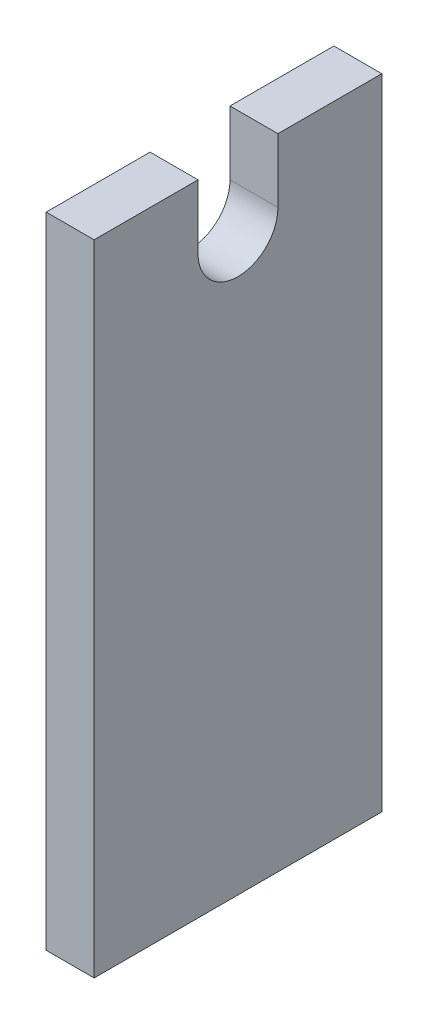
ISO-10303-21;
HEADER;
FILE_DESCRIPTION(('STEP AP214'),'2;1');
FILE_NAME('part.step','',(''),(''),'','','');
FILE_SCHEMA(('AUTOMOTIVE_DESIGN { 1 0 10303 214 1 1 1 1 }'));
ENDSEC;
DATA;
#1=APPLICATION_CONTEXT('core data for automotive mechanical design processes');
#2=APPLICATION_PROTOCOL_DEFINITION('international standard','automotive_design',2000,#1);
#3=PRODUCT_CONTEXT('',#1,'mechanical');
#4=PRODUCT('Part','Part','',(#3));
#5=PRODUCT_RELATED_PRODUCT_CATEGORY('part','',(#4));
#6=PRODUCT_DEFINITION_FORMATION('','',#4);
#7=PRODUCT_DEFINITION_CONTEXT('part definition',#1,'design');
#8=PRODUCT_DEFINITION('design','',#6,#7);
#9=PRODUCT_DEFINITION_SHAPE('','',#8);
#10=(LENGTH_UNIT() NAMED_UNIT(*) SI_UNIT(.MILLI.,.METRE.));
#11=(NAMED_UNIT(*) PLANE_ANGLE_UNIT() SI_UNIT($,.RADIAN.));
#12=(NAMED_UNIT(*) SI_UNIT($,.STERADIAN.) SOLID_ANGLE_UNIT());
#13=UNCERTAINTY_MEASURE_WITH_UNIT(LENGTH_MEASURE(1.E-05),#10,'distance_accuracy_value','');
#14=(GEOMETRIC_REPRESENTATION_CONTEXT(3) GLOBAL_UNCERTAINTY_ASSIGNED_CONTEXT((#13)) GLOBAL_UNIT_ASSIGNED_CONTEXT((#10,
#11,#12)) REPRESENTATION_CONTEXT('',''));
#15=CARTESIAN_POINT('',(0.,0.,0.));
#16=DIRECTION('',(0.,0.,1.));
#17=DIRECTION('',(1.,0.,0.));
#18=AXIS2_PLACEMENT_3D('',#15,#16,#17);
#19=CARTESIAN_POINT('',(19.05,254.,0.));
#20=DIRECTION('',(0.,-1.,0.));
#21=DIRECTION('',(0.,0.,-1.));
#22=AXIS2_PLACEMENT_3D('',#19,#20,#21);
#23=PLANE('',#22);
#24=DIRECTION('',(1.,0.,0.));
#25=VECTOR('',#24,1.);
#26=CARTESIAN_POINT('',(0.,254.,-41.275));
#27=LINE('',#26,#25);
#28=CARTESIAN_POINT('',(0.,254.,-41.275));
#29=VERTEX_POINT('',#28);
#30=CARTESIAN_POINT('',(19.05,254.,-41.275));
#31=VERTEX_POINT('',#30);
#32=EDGE_CURVE('E144',#29,#31,#27,.T.);
#33=ORIENTED_EDGE('',*,*,#32,.F.);
#34=DIRECTION('',(0.,0.,1.));
#35=VECTOR('',#34,1.);
#36=CARTESIAN_POINT('',(0.,254.,0.));
#37=LINE('',#36,#35);
#38=CARTESIAN_POINT('',(0.,254.,0.));
#39=VERTEX_POINT('',#38);
#40=EDGE_CURVE('E80',#29,#39,#37,.T.);
#41=ORIENTED_EDGE('',*,*,#40,.T.);
#42=DIRECTION('',(-1.,0.,0.));
#43=VECTOR('',#42,1.);
#44=CARTESIAN_POINT('',(19.05,254.,0.));
#45=LINE('',#44,#43);
#46=CARTESIAN_POINT('',(19.05,254.,0.));
#47=VERTEX_POINT('',#46);
#48=EDGE_CURVE('E157',#47,#39,#45,.T.);
#49=ORIENTED_EDGE('',*,*,#48,.F.);
#50=DIRECTION('',(0.,0.,1.));
#51=VECTOR('',#50,1.);
#52=CARTESIAN_POINT('',(19.05,254.,0.));
#53=LINE('',#52,#51);
#54=EDGE_CURVE('E58',#31,#47,#53,.T.);
#55=ORIENTED_EDGE('',*,*,#54,.F.);
#56=EDGE_LOOP('',(#33,#41,#49,#55));
#57=FACE_BOUND('',#56,.T.);
#58=ADVANCED_FACE('F34',(#57),#23,.F.);
#59=CARTESIAN_POINT('',(19.05,0.,0.));
#60=DIRECTION('',(-1.,0.,0.));
#61=DIRECTION('',(0.,0.,1.));
#62=AXIS2_PLACEMENT_3D('',#59,#60,#61);
#63=PLANE('',#62);
#64=DIRECTION('',(0.,1.,0.));
#65=VECTOR('',#64,1.);
#66=CARTESIAN_POINT('',(19.05,0.,-41.2750000000001));
#67=LINE('',#66,#65);
#68=CARTESIAN_POINT('',(19.05,228.6,-41.275));
#69=VERTEX_POINT('',#68);
#70=EDGE_CURVE('E129',#69,#31,#67,.T.);
#71=ORIENTED_EDGE('',*,*,#70,.T.);
#72=ORIENTED_EDGE('',*,*,#54,.T.);
#73=DIRECTION('',(0.,-1.,0.));
#74=VECTOR('',#73,1.);
#75=CARTESIAN_POINT('',(19.05,0.,0.));
#76=LINE('',#75,#74);
#77=CARTESIAN_POINT('',(19.05,0.,0.));
#78=VERTEX_POINT('',#77);
#79=EDGE_CURVE('E147',#47,#78,#76,.T.);
#80=ORIENTED_EDGE('',*,*,#79,.T.);
#81=DIRECTION('',(0.,0.,-1.));
#82=VECTOR('',#81,1.);
#83=CARTESIAN_POINT('',(19.05,0.,0.));
#84=LINE('',#83,#82);
#85=CARTESIAN_POINT('',(19.05,0.,-114.3));
#86=VERTEX_POINT('',#85);
#87=EDGE_CURVE('E87',#78,#86,#84,.T.);
#88=ORIENTED_EDGE('',*,*,#87,.T.);
#89=DIRECTION('',(0.,1.,0.));
#90=VECTOR('',#89,1.);
#91=CARTESIAN_POINT('',(19.05,0.,-114.3));
#92=LINE('',#91,#90);
#93=CARTESIAN_POINT('',(19.05,254.,-114.3));
#94=VERTEX_POINT('',#93);
#95=EDGE_CURVE('E152',#86,#94,#92,.T.);
#96=ORIENTED_EDGE('',*,*,#95,.T.);
#97=CARTESIAN_POINT('',(19.05,254.,-73.025));
#98=VERTEX_POINT('',#97);
#99=EDGE_CURVE('E154',#94,#98,#53,.T.);
#100=ORIENTED_EDGE('',*,*,#99,.T.);
#101=DIRECTION('',(0.,1.,0.));
#102=VECTOR('',#101,1.);
#103=CARTESIAN_POINT('',(19.05,0.,-73.025));
#104=LINE('',#103,#102);
#105=CARTESIAN_POINT('',(19.05,228.6,-73.025));
#106=VERTEX_POINT('',#105);
#107=EDGE_CURVE('E134',#106,#98,#104,.T.);
#108=ORIENTED_EDGE('',*,*,#107,.F.);
#109=CARTESIAN_POINT('',(19.05,228.6,-57.15));
#110=DIRECTION('',(1.,0.,0.));
#111=DIRECTION('',(0.,0.,-1.));
#112=AXIS2_PLACEMENT_3D('',#109,#110,#111);
#113=CIRCLE('',#112,15.875);
#114=EDGE_CURVE('E116',#69,#106,#113,.T.);
#115=ORIENTED_EDGE('',*,*,#114,.F.);
#116=EDGE_LOOP('',(#71,#72,#80,#88,#96,#100,#108,#115));
#117=FACE_BOUND('',#116,.T.);
#118=ADVANCED_FACE('F178',(#117),#63,.F.);
#119=CARTESIAN_POINT('',(0.,0.,0.));
#120=DIRECTION('',(-1.,0.,0.));
#121=DIRECTION('',(0.,0.,1.));
#122=AXIS2_PLACEMENT_3D('',#119,#120,#121);
#123=PLANE('',#122);
#124=ORIENTED_EDGE('',*,*,#40,.F.);
#125=DIRECTION('',(0.,1.,0.));
#126=VECTOR('',#125,1.);
#127=CARTESIAN_POINT('',(0.,0.,-41.2750000000001));
#128=LINE('',#127,#126);
#129=CARTESIAN_POINT('',(0.,228.6,-41.275));
#130=VERTEX_POINT('',#129);
#131=EDGE_CURVE('E119',#130,#29,#128,.T.);
#132=ORIENTED_EDGE('',*,*,#131,.F.);
#133=CARTESIAN_POINT('',(0.,228.6,-57.15));
#134=DIRECTION('',(1.,0.,0.));
#135=DIRECTION('',(0.,0.,-1.));
#136=AXIS2_PLACEMENT_3D('',#133,#134,#135);
#137=CIRCLE('',#136,15.875);
#138=CARTESIAN_POINT('',(0.,228.6,-73.025));
#139=VERTEX_POINT('',#138);
#140=EDGE_CURVE('E113',#130,#139,#137,.T.);
#141=ORIENTED_EDGE('',*,*,#140,.T.);
#142=DIRECTION('',(0.,1.,0.));
#143=VECTOR('',#142,1.);
#144=CARTESIAN_POINT('',(0.,0.,-73.025));
#145=LINE('',#144,#143);
#146=CARTESIAN_POINT('',(0.,254.,-73.025));
#147=VERTEX_POINT('',#146);
#148=EDGE_CURVE('E121',#139,#147,#145,.T.);
#149=ORIENTED_EDGE('',*,*,#148,.T.);
#150=CARTESIAN_POINT('',(0.,254.,-114.3));
#151=VERTEX_POINT('',#150);
#152=EDGE_CURVE('E150',#151,#147,#37,.T.);
#153=ORIENTED_EDGE('',*,*,#152,.F.);
#154=DIRECTION('',(0.,1.,0.));
#155=VECTOR('',#154,1.);
#156=CARTESIAN_POINT('',(0.,0.,-114.3));
#157=LINE('',#156,#155);
#158=CARTESIAN_POINT('',(0.,0.,-114.3));
#159=VERTEX_POINT('',#158);
#160=EDGE_CURVE('E162',#159,#151,#157,.T.);
#161=ORIENTED_EDGE('',*,*,#160,.F.);
#162=DIRECTION('',(0.,0.,-1.));
#163=VECTOR('',#162,1.);
#164=CARTESIAN_POINT('',(0.,0.,0.));
#165=LINE('',#164,#163);
#166=CARTESIAN_POINT('',(0.,0.,0.));
#167=VERTEX_POINT('',#166);
#168=EDGE_CURVE('E160',#167,#159,#165,.T.);
#169=ORIENTED_EDGE('',*,*,#168,.F.);
#170=DIRECTION('',(0.,-1.,0.));
#171=VECTOR('',#170,1.);
#172=CARTESIAN_POINT('',(0.,0.,0.));
#173=LINE('',#172,#171);
#174=EDGE_CURVE('E143',#39,#167,#173,.T.);
#175=ORIENTED_EDGE('',*,*,#174,.F.);
#176=EDGE_LOOP('',(#124,#132,#141,#149,#153,#161,#169,#175));
#177=FACE_BOUND('',#176,.T.);
#178=ADVANCED_FACE('F127',(#177),#123,.T.);
#179=CARTESIAN_POINT('',(19.05,0.,0.));
#180=DIRECTION('',(0.,0.,-1.));
#181=DIRECTION('',(-1.,0.,0.));
#182=AXIS2_PLACEMENT_3D('',#179,#180,#181);
#183=PLANE('',#182);
#184=ORIENTED_EDGE('',*,*,#174,.T.);
#185=DIRECTION('',(-1.,0.,0.));
#186=VECTOR('',#185,1.);
#187=CARTESIAN_POINT('',(19.05,0.,0.));
#188=LINE('',#187,#186);
#189=EDGE_CURVE('E11',#78,#167,#188,.T.);
#190=ORIENTED_EDGE('',*,*,#189,.F.);
#191=ORIENTED_EDGE('',*,*,#79,.F.);
#192=ORIENTED_EDGE('',*,*,#48,.T.);
#193=EDGE_LOOP('',(#184,#190,#191,#192));
#194=FACE_BOUND('',#193,.T.);
#195=ADVANCED_FACE('F36',(#194),#183,.F.);
#196=CARTESIAN_POINT('',(19.05,0.,0.));
#197=DIRECTION('',(0.,1.,0.));
#198=DIRECTION('',(0.,0.,1.));
#199=AXIS2_PLACEMENT_3D('',#196,#197,#198);
#200=PLANE('',#199);
#201=ORIENTED_EDGE('',*,*,#168,.T.);
#202=DIRECTION('',(-1.,0.,0.));
#203=VECTOR('',#202,1.);
#204=CARTESIAN_POINT('',(19.05,0.,-114.3));
#205=LINE('',#204,#203);
#206=EDGE_CURVE('E42',#86,#159,#205,.T.);
#207=ORIENTED_EDGE('',*,*,#206,.F.);
#208=ORIENTED_EDGE('',*,*,#87,.F.);
#209=ORIENTED_EDGE('',*,*,#189,.T.);
#210=EDGE_LOOP('',(#201,#207,#208,#209));
#211=FACE_BOUND('',#210,.T.);
#212=ADVANCED_FACE('F182',(#211),#200,.F.);
#213=CARTESIAN_POINT('',(19.05,0.,-114.3));
#214=DIRECTION('',(0.,0.,1.));
#215=DIRECTION('',(1.,0.,0.));
#216=AXIS2_PLACEMENT_3D('',#213,#214,#215);
#217=PLANE('',#216);
#218=ORIENTED_EDGE('',*,*,#160,.T.);
#219=DIRECTION('',(-1.,0.,0.));
#220=VECTOR('',#219,1.);
#221=CARTESIAN_POINT('',(19.05,254.,-114.3));
#222=LINE('',#221,#220);
#223=EDGE_CURVE('E166',#94,#151,#222,.T.);
#224=ORIENTED_EDGE('',*,*,#223,.F.);
#225=ORIENTED_EDGE('',*,*,#95,.F.);
#226=ORIENTED_EDGE('',*,*,#206,.T.);
#227=EDGE_LOOP('',(#218,#224,#225,#226));
#228=FACE_BOUND('',#227,.T.);
#229=ADVANCED_FACE('F172',(#228),#217,.F.);
#230=ORIENTED_EDGE('',*,*,#152,.T.);
#231=DIRECTION('',(1.,0.,0.));
#232=VECTOR('',#231,1.);
#233=CARTESIAN_POINT('',(0.,254.,-73.025));
#234=LINE('',#233,#232);
#235=EDGE_CURVE('E49',#147,#98,#234,.T.);
#236=ORIENTED_EDGE('',*,*,#235,.T.);
#237=ORIENTED_EDGE('',*,*,#99,.F.);
#238=ORIENTED_EDGE('',*,*,#223,.T.);
#239=EDGE_LOOP('',(#230,#236,#237,#238));
#240=FACE_BOUND('',#239,.T.);
#241=ADVANCED_FACE('F176',(#240),#23,.F.);
#242=CARTESIAN_POINT('',(0.,228.6,-57.15));
#243=DIRECTION('',(1.,0.,0.));
#244=DIRECTION('',(0.,0.,-1.));
#245=AXIS2_PLACEMENT_3D('',#242,#243,#244);
#246=CYLINDRICAL_SURFACE('',#245,15.875);
#247=ORIENTED_EDGE('',*,*,#114,.T.);
#248=DIRECTION('',(1.,0.,0.));
#249=VECTOR('',#248,1.);
#250=CARTESIAN_POINT('',(0.,228.6,-73.025));
#251=LINE('',#250,#249);
#252=EDGE_CURVE('E110',#139,#106,#251,.T.);
#253=ORIENTED_EDGE('',*,*,#252,.F.);
#254=ORIENTED_EDGE('',*,*,#140,.F.);
#255=DIRECTION('',(1.,0.,0.));
#256=VECTOR('',#255,1.);
#257=CARTESIAN_POINT('',(0.,228.6,-41.275));
#258=LINE('',#257,#256);
#259=EDGE_CURVE('E140',#130,#69,#258,.T.);
#260=ORIENTED_EDGE('',*,*,#259,.T.);
#261=EDGE_LOOP('',(#247,#253,#254,#260));
#262=FACE_BOUND('',#261,.T.);
#263=ADVANCED_FACE('F111',(#262),#246,.F.);
#264=CARTESIAN_POINT('',(0.,0.,-41.2750000000001));
#265=DIRECTION('',(0.,0.,-1.));
#266=DIRECTION('',(0.,1.,0.));
#267=AXIS2_PLACEMENT_3D('',#264,#265,#266);
#268=PLANE('',#267);
#269=ORIENTED_EDGE('',*,*,#70,.F.);
#270=ORIENTED_EDGE('',*,*,#259,.F.);
#271=ORIENTED_EDGE('',*,*,#131,.T.);
#272=ORIENTED_EDGE('',*,*,#32,.T.);
#273=EDGE_LOOP('',(#269,#270,#271,#272));
#274=FACE_BOUND('',#273,.T.);
#275=ADVANCED_FACE('F200',(#274),#268,.T.);
#276=CARTESIAN_POINT('',(0.,0.,-73.025));
#277=DIRECTION('',(0.,0.,-1.));
#278=DIRECTION('',(-1.,0.,0.));
#279=AXIS2_PLACEMENT_3D('',#276,#277,#278);
#280=PLANE('',#279);
#281=ORIENTED_EDGE('',*,*,#107,.T.);
#282=ORIENTED_EDGE('',*,*,#235,.F.);
#283=ORIENTED_EDGE('',*,*,#148,.F.);
#284=ORIENTED_EDGE('',*,*,#252,.T.);
#285=EDGE_LOOP('',(#281,#282,#283,#284));
#286=FACE_BOUND('',#285,.T.);
#287=ADVANCED_FACE('F122',(#286),#280,.F.);
#288=CLOSED_SHELL('',(#58,#118,#178,#195,#212,#229,#241,#263,#275,#287));
#289=MANIFOLD_SOLID_BREP('B2',#288);
#290=ADVANCED_BREP_SHAPE_REPRESENTATION('',(#18,#289),#14);
#291=SHAPE_DEFINITION_REPRESENTATION(#9,#290);
ENDSEC;
END-ISO-10303-21;
